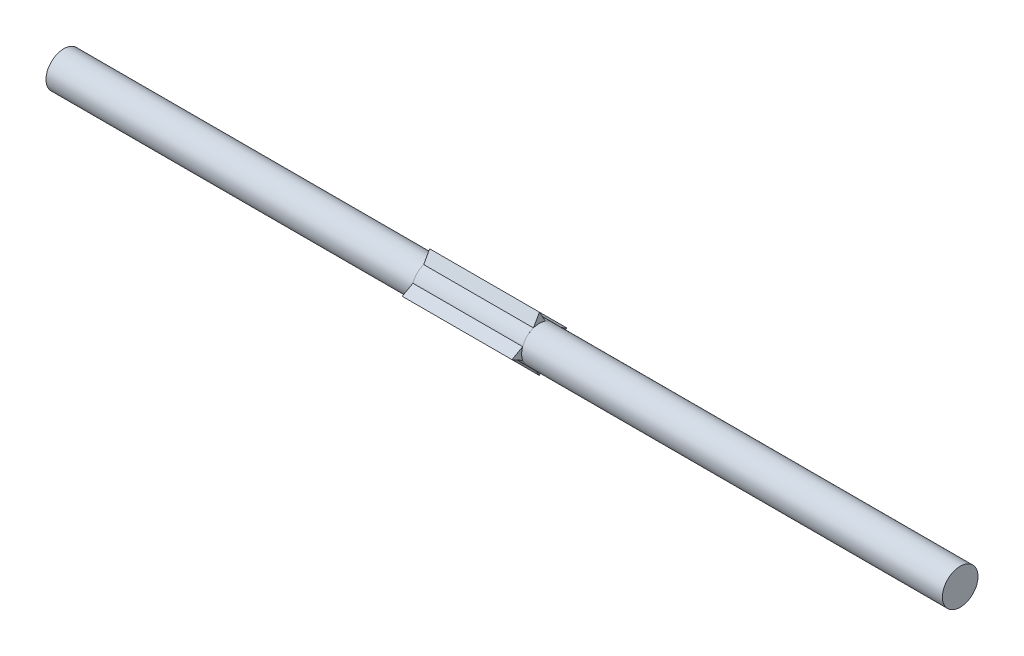
ISO-10303-21;
HEADER;
FILE_DESCRIPTION(('STEP AP214'),'2;1');
FILE_NAME('part.step','',(''),(''),'','','');
FILE_SCHEMA(('AUTOMOTIVE_DESIGN { 1 0 10303 214 1 1 1 1 }'));
ENDSEC;
DATA;
#1=APPLICATION_CONTEXT('core data for automotive mechanical design processes');
#2=APPLICATION_PROTOCOL_DEFINITION('international standard','automotive_design',2000,#1);
#3=PRODUCT_CONTEXT('',#1,'mechanical');
#4=PRODUCT('Part','Part','',(#3));
#5=PRODUCT_RELATED_PRODUCT_CATEGORY('part','',(#4));
#6=PRODUCT_DEFINITION_FORMATION('','',#4);
#7=PRODUCT_DEFINITION_CONTEXT('part definition',#1,'design');
#8=PRODUCT_DEFINITION('design','',#6,#7);
#9=PRODUCT_DEFINITION_SHAPE('','',#8);
#10=(LENGTH_UNIT() NAMED_UNIT(*) SI_UNIT(.MILLI.,.METRE.));
#11=(NAMED_UNIT(*) PLANE_ANGLE_UNIT() SI_UNIT($,.RADIAN.));
#12=(NAMED_UNIT(*) SI_UNIT($,.STERADIAN.) SOLID_ANGLE_UNIT());
#13=UNCERTAINTY_MEASURE_WITH_UNIT(LENGTH_MEASURE(1.E-05),#10,'distance_accuracy_value','');
#14=(GEOMETRIC_REPRESENTATION_CONTEXT(3) GLOBAL_UNCERTAINTY_ASSIGNED_CONTEXT((#13)) GLOBAL_UNIT_ASSIGNED_CONTEXT((#10,
#11,#12)) REPRESENTATION_CONTEXT('',''));
#15=CARTESIAN_POINT('',(0.,0.,0.));
#16=DIRECTION('',(0.,0.,1.));
#17=DIRECTION('',(1.,0.,0.));
#18=AXIS2_PLACEMENT_3D('',#15,#16,#17);
#19=CARTESIAN_POINT('',(15.,0.,0.));
#20=DIRECTION('',(1.,0.,0.));
#21=DIRECTION('',(0.,0.,-1.));
#22=AXIS2_PLACEMENT_3D('',#19,#20,#21);
#23=PLANE('',#22);
#24=CARTESIAN_POINT('',(15.,0.,0.));
#25=DIRECTION('',(1.,0.,0.));
#26=DIRECTION('',(0.,0.,-1.));
#27=AXIS2_PLACEMENT_3D('',#24,#25,#26);
#28=CIRCLE('',#27,4.8625);
#29=CARTESIAN_POINT('',(15.,-1.63235290016241,-4.58031988613583));
#30=VERTEX_POINT('',#29);
#31=CARTESIAN_POINT('',(15.,-4.58031988613585,-1.63235290016237));
#32=VERTEX_POINT('',#31);
#33=EDGE_CURVE('E50',#30,#32,#28,.F.);
#34=ORIENTED_EDGE('',*,*,#33,.F.);
#35=DIRECTION('',(0.,0.487996068424335,-0.87284582670847));
#36=VECTOR('',#35,1.);
#37=CARTESIAN_POINT('',(15.,0.,-7.49999999999954));
#38=LINE('',#37,#36);
#39=CARTESIAN_POINT('',(15.,0.,-7.49999999999954));
#40=VERTEX_POINT('',#39);
#41=EDGE_CURVE('E229',#30,#40,#38,.T.);
#42=ORIENTED_EDGE('',*,*,#41,.T.);
#43=DIRECTION('',(0.,0.487996068424338,0.872845826708468));
#44=VECTOR('',#43,1.);
#45=CARTESIAN_POINT('',(15.,0.,-7.49999999999954));
#46=LINE('',#45,#44);
#47=CARTESIAN_POINT('',(15.,1.63235290016236,-4.58031988613585));
#48=VERTEX_POINT('',#47);
#49=EDGE_CURVE('E215',#40,#48,#46,.T.);
#50=ORIENTED_EDGE('',*,*,#49,.T.);
#51=CARTESIAN_POINT('',(15.,4.58031988613584,-1.6323529001624));
#52=VERTEX_POINT('',#51);
#53=EDGE_CURVE('E166',#52,#48,#28,.F.);
#54=ORIENTED_EDGE('',*,*,#53,.F.);
#55=DIRECTION('',(0.,0.872845826708468,0.487996068424338));
#56=VECTOR('',#55,1.);
#57=CARTESIAN_POINT('',(15.,7.49999999999954,0.));
#58=LINE('',#57,#56);
#59=CARTESIAN_POINT('',(15.,7.49999999999954,0.));
#60=VERTEX_POINT('',#59);
#61=EDGE_CURVE('E219',#52,#60,#58,.T.);
#62=ORIENTED_EDGE('',*,*,#61,.T.);
#63=DIRECTION('',(0.,-0.872845826708468,0.487996068424338));
#64=VECTOR('',#63,1.);
#65=CARTESIAN_POINT('',(15.,7.49999999999954,0.));
#66=LINE('',#65,#64);
#67=CARTESIAN_POINT('',(15.,4.58031988613584,1.6323529001624));
#68=VERTEX_POINT('',#67);
#69=EDGE_CURVE('E112',#60,#68,#66,.T.);
#70=ORIENTED_EDGE('',*,*,#69,.T.);
#71=CARTESIAN_POINT('',(15.,1.63235290016236,4.58031988613585));
#72=VERTEX_POINT('',#71);
#73=EDGE_CURVE('E106',#72,#68,#28,.F.);
#74=ORIENTED_EDGE('',*,*,#73,.F.);
#75=DIRECTION('',(0.,-0.487996068424314,0.872845826708481));
#76=VECTOR('',#75,1.);
#77=CARTESIAN_POINT('',(15.,0.,7.49999999999954));
#78=LINE('',#77,#76);
#79=CARTESIAN_POINT('',(15.,0.,7.49999999999954));
#80=VERTEX_POINT('',#79);
#81=EDGE_CURVE('E188',#72,#80,#78,.T.);
#82=ORIENTED_EDGE('',*,*,#81,.T.);
#83=DIRECTION('',(0.,-0.487996068424347,-0.872845826708463));
#84=VECTOR('',#83,1.);
#85=CARTESIAN_POINT('',(15.,0.,7.49999999999954));
#86=LINE('',#85,#84);
#87=CARTESIAN_POINT('',(15.,-1.63235290016235,4.58031988613585));
#88=VERTEX_POINT('',#87);
#89=EDGE_CURVE('E186',#80,#88,#86,.T.);
#90=ORIENTED_EDGE('',*,*,#89,.T.);
#91=CARTESIAN_POINT('',(15.,-4.58031988613582,1.63235290016243));
#92=VERTEX_POINT('',#91);
#93=EDGE_CURVE('E173',#92,#88,#28,.F.);
#94=ORIENTED_EDGE('',*,*,#93,.F.);
#95=DIRECTION('',(0.,-0.87284582670846,-0.487996068424352));
#96=VECTOR('',#95,1.);
#97=CARTESIAN_POINT('',(15.,-7.49999999999948,0.));
#98=LINE('',#97,#96);
#99=CARTESIAN_POINT('',(15.,-7.49999999999948,0.));
#100=VERTEX_POINT('',#99);
#101=EDGE_CURVE('E192',#92,#100,#98,.T.);
#102=ORIENTED_EDGE('',*,*,#101,.T.);
#103=DIRECTION('',(0.,0.872845826708466,-0.487996068424341));
#104=VECTOR('',#103,1.);
#105=CARTESIAN_POINT('',(15.,-7.49999999999948,0.));
#106=LINE('',#105,#104);
#107=EDGE_CURVE('E231',#100,#32,#106,.T.);
#108=ORIENTED_EDGE('',*,*,#107,.T.);
#109=EDGE_LOOP('',(#34,#42,#50,#54,#62,#70,#74,#82,#90,#94,#102,#108));
#110=FACE_BOUND('',#109,.T.);
#111=ADVANCED_FACE('F46',(#110),#23,.T.);
#112=CARTESIAN_POINT('',(-15.,0.,0.));
#113=DIRECTION('',(-1.,0.,0.));
#114=DIRECTION('',(0.,0.,1.));
#115=AXIS2_PLACEMENT_3D('',#112,#113,#114);
#116=PLANE('',#115);
#117=CARTESIAN_POINT('',(-15.,0.,0.));
#118=DIRECTION('',(-1.,0.,0.));
#119=DIRECTION('',(0.,0.,1.));
#120=AXIS2_PLACEMENT_3D('',#117,#118,#119);
#121=CIRCLE('',#120,4.8625);
#122=CARTESIAN_POINT('',(-15.,-1.63235290016235,4.58031988613585));
#123=VERTEX_POINT('',#122);
#124=CARTESIAN_POINT('',(-15.,-4.58031988613583,1.63235290016243));
#125=VERTEX_POINT('',#124);
#126=EDGE_CURVE('E160',#123,#125,#121,.F.);
#127=ORIENTED_EDGE('',*,*,#126,.F.);
#128=DIRECTION('',(0.,-0.487996068424347,-0.872845826708463));
#129=VECTOR('',#128,1.);
#130=CARTESIAN_POINT('',(-15.,0.,7.49999999999954));
#131=LINE('',#130,#129);
#132=CARTESIAN_POINT('',(-15.,0.,7.49999999999954));
#133=VERTEX_POINT('',#132);
#134=EDGE_CURVE('E195',#133,#123,#131,.T.);
#135=ORIENTED_EDGE('',*,*,#134,.F.);
#136=DIRECTION('',(0.,-0.487996068424314,0.872845826708481));
#137=VECTOR('',#136,1.);
#138=CARTESIAN_POINT('',(-15.,0.,7.49999999999954));
#139=LINE('',#138,#137);
#140=CARTESIAN_POINT('',(-15.,1.63235290016236,4.58031988613585));
#141=VERTEX_POINT('',#140);
#142=EDGE_CURVE('E153',#141,#133,#139,.T.);
#143=ORIENTED_EDGE('',*,*,#142,.F.);
#144=CARTESIAN_POINT('',(-15.,4.58031988613584,1.6323529001624));
#145=VERTEX_POINT('',#144);
#146=EDGE_CURVE('E147',#145,#141,#121,.F.);
#147=ORIENTED_EDGE('',*,*,#146,.F.);
#148=DIRECTION('',(0.,-0.872845826708468,0.487996068424338));
#149=VECTOR('',#148,1.);
#150=CARTESIAN_POINT('',(-15.,7.49999999999954,0.));
#151=LINE('',#150,#149);
#152=CARTESIAN_POINT('',(-15.,7.49999999999954,0.));
#153=VERTEX_POINT('',#152);
#154=EDGE_CURVE('E56',#153,#145,#151,.T.);
#155=ORIENTED_EDGE('',*,*,#154,.F.);
#156=DIRECTION('',(0.,0.872845826708468,0.487996068424338));
#157=VECTOR('',#156,1.);
#158=CARTESIAN_POINT('',(-15.,7.49999999999954,0.));
#159=LINE('',#158,#157);
#160=CARTESIAN_POINT('',(-15.,4.58031988613584,-1.6323529001624));
#161=VERTEX_POINT('',#160);
#162=EDGE_CURVE('E13',#161,#153,#159,.T.);
#163=ORIENTED_EDGE('',*,*,#162,.F.);
#164=CARTESIAN_POINT('',(-15.,1.63235290016236,-4.58031988613585));
#165=VERTEX_POINT('',#164);
#166=EDGE_CURVE('E159',#165,#161,#121,.F.);
#167=ORIENTED_EDGE('',*,*,#166,.F.);
#168=DIRECTION('',(0.,0.487996068424338,0.872845826708468));
#169=VECTOR('',#168,1.);
#170=CARTESIAN_POINT('',(-15.,0.,-7.49999999999954));
#171=LINE('',#170,#169);
#172=CARTESIAN_POINT('',(-15.,0.,-7.49999999999954));
#173=VERTEX_POINT('',#172);
#174=EDGE_CURVE('E216',#173,#165,#171,.T.);
#175=ORIENTED_EDGE('',*,*,#174,.F.);
#176=DIRECTION('',(0.,0.487996068424335,-0.87284582670847));
#177=VECTOR('',#176,1.);
#178=CARTESIAN_POINT('',(-15.,0.,-7.49999999999954));
#179=LINE('',#178,#177);
#180=CARTESIAN_POINT('',(-15.,-1.63235290016241,-4.58031988613583));
#181=VERTEX_POINT('',#180);
#182=EDGE_CURVE('E120',#181,#173,#179,.T.);
#183=ORIENTED_EDGE('',*,*,#182,.F.);
#184=CARTESIAN_POINT('',(-15.,-4.58031988613585,-1.63235290016237));
#185=VERTEX_POINT('',#184);
#186=EDGE_CURVE('E163',#185,#181,#121,.F.);
#187=ORIENTED_EDGE('',*,*,#186,.F.);
#188=DIRECTION('',(0.,0.872845826708466,-0.487996068424341));
#189=VECTOR('',#188,1.);
#190=CARTESIAN_POINT('',(-15.,-7.49999999999948,0.));
#191=LINE('',#190,#189);
#192=CARTESIAN_POINT('',(-15.,-7.49999999999948,0.));
#193=VERTEX_POINT('',#192);
#194=EDGE_CURVE('E221',#193,#185,#191,.T.);
#195=ORIENTED_EDGE('',*,*,#194,.F.);
#196=DIRECTION('',(0.,-0.87284582670846,-0.487996068424352));
#197=VECTOR('',#196,1.);
#198=CARTESIAN_POINT('',(-15.,-7.49999999999948,0.));
#199=LINE('',#198,#197);
#200=EDGE_CURVE('E224',#125,#193,#199,.T.);
#201=ORIENTED_EDGE('',*,*,#200,.F.);
#202=EDGE_LOOP('',(#127,#135,#143,#147,#155,#163,#167,#175,#183,#187,#195,#201));
#203=FACE_BOUND('',#202,.T.);
#204=ADVANCED_FACE('F157',(#203),#116,.T.);
#205=CARTESIAN_POINT('',(-115.,0.,0.));
#206=DIRECTION('',(-1.,0.,0.));
#207=DIRECTION('',(0.,0.,1.));
#208=AXIS2_PLACEMENT_3D('',#205,#206,#207);
#209=CYLINDRICAL_SURFACE('',#208,4.8625);
#210=DIRECTION('',(-1.,0.,0.));
#211=VECTOR('',#210,1.);
#212=CARTESIAN_POINT('',(15.,-4.58031988613582,1.63235290016243));
#213=LINE('',#212,#211);
#214=EDGE_CURVE('E182',#92,#125,#213,.T.);
#215=ORIENTED_EDGE('',*,*,#214,.F.);
#216=ORIENTED_EDGE('',*,*,#93,.T.);
#217=DIRECTION('',(-1.,0.,0.));
#218=VECTOR('',#217,1.);
#219=CARTESIAN_POINT('',(15.,-1.63235290016235,4.58031988613585));
#220=LINE('',#219,#218);
#221=EDGE_CURVE('E180',#88,#123,#220,.T.);
#222=ORIENTED_EDGE('',*,*,#221,.T.);
#223=ORIENTED_EDGE('',*,*,#126,.T.);
#224=EDGE_LOOP('',(#215,#216,#222,#223));
#225=FACE_BOUND('',#224,.T.);
#226=ADVANCED_FACE('F178',(#225),#209,.T.);
#227=CARTESIAN_POINT('',(15.,-7.49999999999948,0.));
#228=DIRECTION('',(0.,0.487996068424352,-0.87284582670846));
#229=DIRECTION('',(0.,0.87284582670846,0.487996068424352));
#230=AXIS2_PLACEMENT_3D('',#227,#228,#229);
#231=PLANE('',#230);
#232=ORIENTED_EDGE('',*,*,#200,.T.);
#233=DIRECTION('',(-1.,0.,0.));
#234=VECTOR('',#233,1.);
#235=CARTESIAN_POINT('',(15.,-7.49999999999948,0.));
#236=LINE('',#235,#234);
#237=EDGE_CURVE('E198',#100,#193,#236,.T.);
#238=ORIENTED_EDGE('',*,*,#237,.F.);
#239=ORIENTED_EDGE('',*,*,#101,.F.);
#240=ORIENTED_EDGE('',*,*,#214,.T.);
#241=EDGE_LOOP('',(#232,#238,#239,#240));
#242=FACE_BOUND('',#241,.T.);
#243=ADVANCED_FACE('F254',(#242),#231,.F.);
#244=DIRECTION('',(-1.,0.,0.));
#245=VECTOR('',#244,1.);
#246=CARTESIAN_POINT('',(15.,-1.63235290016241,-4.58031988613583));
#247=LINE('',#246,#245);
#248=EDGE_CURVE('E207',#30,#181,#247,.T.);
#249=ORIENTED_EDGE('',*,*,#248,.F.);
#250=ORIENTED_EDGE('',*,*,#33,.T.);
#251=DIRECTION('',(-1.,0.,0.));
#252=VECTOR('',#251,1.);
#253=CARTESIAN_POINT('',(15.,-4.58031988613585,-1.63235290016237));
#254=LINE('',#253,#252);
#255=EDGE_CURVE('E205',#32,#185,#254,.T.);
#256=ORIENTED_EDGE('',*,*,#255,.T.);
#257=ORIENTED_EDGE('',*,*,#186,.T.);
#258=EDGE_LOOP('',(#249,#250,#256,#257));
#259=FACE_BOUND('',#258,.T.);
#260=ADVANCED_FACE('F48',(#259),#209,.T.);
#261=CARTESIAN_POINT('',(15.,-7.49999999999948,0.));
#262=DIRECTION('',(0.,0.487996068424341,0.872845826708466));
#263=DIRECTION('',(0.,-0.872845826708466,0.487996068424341));
#264=AXIS2_PLACEMENT_3D('',#261,#262,#263);
#265=PLANE('',#264);
#266=ORIENTED_EDGE('',*,*,#194,.T.);
#267=ORIENTED_EDGE('',*,*,#255,.F.);
#268=ORIENTED_EDGE('',*,*,#107,.F.);
#269=ORIENTED_EDGE('',*,*,#237,.T.);
#270=EDGE_LOOP('',(#266,#267,#268,#269));
#271=FACE_BOUND('',#270,.T.);
#272=ADVANCED_FACE('F250',(#271),#265,.F.);
#273=DIRECTION('',(-1.,0.,0.));
#274=VECTOR('',#273,1.);
#275=CARTESIAN_POINT('',(15.,1.63235290016236,4.58031988613585));
#276=LINE('',#275,#274);
#277=EDGE_CURVE('E148',#72,#141,#276,.T.);
#278=ORIENTED_EDGE('',*,*,#277,.F.);
#279=ORIENTED_EDGE('',*,*,#73,.T.);
#280=DIRECTION('',(-1.,0.,0.));
#281=VECTOR('',#280,1.);
#282=CARTESIAN_POINT('',(15.,4.58031988613584,1.6323529001624));
#283=LINE('',#282,#281);
#284=EDGE_CURVE('E145',#68,#145,#283,.T.);
#285=ORIENTED_EDGE('',*,*,#284,.T.);
#286=ORIENTED_EDGE('',*,*,#146,.T.);
#287=EDGE_LOOP('',(#278,#279,#285,#286));
#288=FACE_BOUND('',#287,.T.);
#289=ADVANCED_FACE('F146',(#288),#209,.T.);
#290=CARTESIAN_POINT('',(15.,0.,7.49999999999954));
#291=DIRECTION('',(0.,0.872845826708463,-0.487996068424347));
#292=DIRECTION('',(0.,0.487996068424347,0.872845826708463));
#293=AXIS2_PLACEMENT_3D('',#290,#291,#292);
#294=PLANE('',#293);
#295=ORIENTED_EDGE('',*,*,#134,.T.);
#296=ORIENTED_EDGE('',*,*,#221,.F.);
#297=ORIENTED_EDGE('',*,*,#89,.F.);
#298=DIRECTION('',(-1.,0.,0.));
#299=VECTOR('',#298,1.);
#300=CARTESIAN_POINT('',(15.,0.,7.49999999999954));
#301=LINE('',#300,#299);
#302=EDGE_CURVE('E196',#80,#133,#301,.T.);
#303=ORIENTED_EDGE('',*,*,#302,.T.);
#304=EDGE_LOOP('',(#295,#296,#297,#303));
#305=FACE_BOUND('',#304,.T.);
#306=ADVANCED_FACE('F194',(#305),#294,.F.);
#307=CARTESIAN_POINT('',(15.,0.,7.49999999999954));
#308=DIRECTION('',(0.,-0.872845826708481,-0.487996068424314));
#309=DIRECTION('',(0.,0.487996068424314,-0.872845826708482));
#310=AXIS2_PLACEMENT_3D('',#307,#308,#309);
#311=PLANE('',#310);
#312=ORIENTED_EDGE('',*,*,#142,.T.);
#313=ORIENTED_EDGE('',*,*,#302,.F.);
#314=ORIENTED_EDGE('',*,*,#81,.F.);
#315=ORIENTED_EDGE('',*,*,#277,.T.);
#316=EDGE_LOOP('',(#312,#313,#314,#315));
#317=FACE_BOUND('',#316,.T.);
#318=ADVANCED_FACE('F278',(#317),#311,.F.);
#319=DIRECTION('',(-1.,0.,0.));
#320=VECTOR('',#319,1.);
#321=CARTESIAN_POINT('',(15.,4.58031988613584,-1.6323529001624));
#322=LINE('',#321,#320);
#323=EDGE_CURVE('E213',#52,#161,#322,.T.);
#324=ORIENTED_EDGE('',*,*,#323,.F.);
#325=ORIENTED_EDGE('',*,*,#53,.T.);
#326=DIRECTION('',(-1.,0.,0.));
#327=VECTOR('',#326,1.);
#328=CARTESIAN_POINT('',(15.,1.63235290016236,-4.58031988613585));
#329=LINE('',#328,#327);
#330=EDGE_CURVE('E211',#48,#165,#329,.T.);
#331=ORIENTED_EDGE('',*,*,#330,.T.);
#332=ORIENTED_EDGE('',*,*,#166,.T.);
#333=EDGE_LOOP('',(#324,#325,#331,#332));
#334=FACE_BOUND('',#333,.T.);
#335=ADVANCED_FACE('F240',(#334),#209,.T.);
#336=CARTESIAN_POINT('',(15.,7.49999999999954,0.));
#337=DIRECTION('',(0.,-0.487996068424338,-0.872845826708468));
#338=DIRECTION('',(0.,0.872845826708468,-0.487996068424338));
#339=AXIS2_PLACEMENT_3D('',#336,#337,#338);
#340=PLANE('',#339);
#341=ORIENTED_EDGE('',*,*,#154,.T.);
#342=ORIENTED_EDGE('',*,*,#284,.F.);
#343=ORIENTED_EDGE('',*,*,#69,.F.);
#344=DIRECTION('',(-1.,0.,0.));
#345=VECTOR('',#344,1.);
#346=CARTESIAN_POINT('',(15.,7.49999999999954,0.));
#347=LINE('',#346,#345);
#348=EDGE_CURVE('E149',#60,#153,#347,.T.);
#349=ORIENTED_EDGE('',*,*,#348,.T.);
#350=EDGE_LOOP('',(#341,#342,#343,#349));
#351=FACE_BOUND('',#350,.T.);
#352=ADVANCED_FACE('F151',(#351),#340,.F.);
#353=CARTESIAN_POINT('',(15.,7.49999999999954,0.));
#354=DIRECTION('',(0.,-0.487996068424338,0.872845826708468));
#355=DIRECTION('',(0.,-0.872845826708468,-0.487996068424338));
#356=AXIS2_PLACEMENT_3D('',#353,#354,#355);
#357=PLANE('',#356);
#358=ORIENTED_EDGE('',*,*,#162,.T.);
#359=ORIENTED_EDGE('',*,*,#348,.F.);
#360=ORIENTED_EDGE('',*,*,#61,.F.);
#361=ORIENTED_EDGE('',*,*,#323,.T.);
#362=EDGE_LOOP('',(#358,#359,#360,#361));
#363=FACE_BOUND('',#362,.T.);
#364=ADVANCED_FACE('F237',(#363),#357,.F.);
#365=CARTESIAN_POINT('',(15.,0.,-7.49999999999954));
#366=DIRECTION('',(0.,-0.872845826708468,0.487996068424338));
#367=DIRECTION('',(0.,-0.487996068424338,-0.872845826708468));
#368=AXIS2_PLACEMENT_3D('',#365,#366,#367);
#369=PLANE('',#368);
#370=ORIENTED_EDGE('',*,*,#174,.T.);
#371=ORIENTED_EDGE('',*,*,#330,.F.);
#372=ORIENTED_EDGE('',*,*,#49,.F.);
#373=DIRECTION('',(-1.,0.,0.));
#374=VECTOR('',#373,1.);
#375=CARTESIAN_POINT('',(15.,0.,-7.49999999999954));
#376=LINE('',#375,#374);
#377=EDGE_CURVE('E209',#40,#173,#376,.T.);
#378=ORIENTED_EDGE('',*,*,#377,.T.);
#379=EDGE_LOOP('',(#370,#371,#372,#378));
#380=FACE_BOUND('',#379,.T.);
#381=ADVANCED_FACE('F244',(#380),#369,.F.);
#382=CARTESIAN_POINT('',(15.,0.,-7.49999999999954));
#383=DIRECTION('',(0.,0.87284582670847,0.487996068424335));
#384=DIRECTION('',(0.,-0.487996068424335,0.87284582670847));
#385=AXIS2_PLACEMENT_3D('',#382,#383,#384);
#386=PLANE('',#385);
#387=ORIENTED_EDGE('',*,*,#182,.T.);
#388=ORIENTED_EDGE('',*,*,#377,.F.);
#389=ORIENTED_EDGE('',*,*,#41,.F.);
#390=ORIENTED_EDGE('',*,*,#248,.T.);
#391=EDGE_LOOP('',(#387,#388,#389,#390));
#392=FACE_BOUND('',#391,.T.);
#393=ADVANCED_FACE('F256',(#392),#386,.F.);
#394=CLOSED_SHELL('',(#111,#204,#226,#243,#260,#272,#289,#306,#318,#335,#352,#364,#381,#393));
#395=MANIFOLD_SOLID_BREP('B2',#394);
#396=CARTESIAN_POINT('',(15.,0.,0.));
#397=DIRECTION('',(1.,0.,0.));
#398=DIRECTION('',(0.,0.,-1.));
#399=AXIS2_PLACEMENT_3D('',#396,#397,#398);
#400=PLANE('',#399);
#401=CARTESIAN_POINT('',(15.,0.,0.));
#402=DIRECTION('',(1.,0.,0.));
#403=DIRECTION('',(0.,0.,-1.));
#404=AXIS2_PLACEMENT_3D('',#401,#402,#403);
#405=CIRCLE('',#404,4.8625);
#406=CARTESIAN_POINT('',(15.,0.,-4.8625));
#407=VERTEX_POINT('',#406);
#408=EDGE_CURVE('E45',#407,#407,#405,.F.);
#409=ORIENTED_EDGE('',*,*,#408,.T.);
#410=EDGE_LOOP('',(#409));
#411=FACE_BOUND('',#410,.T.);
#412=ADVANCED_FACE('F382',(#411),#400,.F.);
#413=CARTESIAN_POINT('',(-115.,0.,0.));
#414=DIRECTION('',(-1.,0.,0.));
#415=DIRECTION('',(0.,0.,1.));
#416=AXIS2_PLACEMENT_3D('',#413,#414,#415);
#417=CYLINDRICAL_SURFACE('',#416,4.8625);
#418=ORIENTED_EDGE('',*,*,#408,.F.);
#419=EDGE_LOOP('',(#418));
#420=FACE_BOUND('',#419,.T.);
#421=CARTESIAN_POINT('',(130.,0.,0.));
#422=DIRECTION('',(1.,0.,0.));
#423=DIRECTION('',(0.,0.,-1.));
#424=AXIS2_PLACEMENT_3D('',#421,#422,#423);
#425=CIRCLE('',#424,4.8625);
#426=CARTESIAN_POINT('',(130.,0.,-4.8625));
#427=VERTEX_POINT('',#426);
#428=EDGE_CURVE('E389',#427,#427,#425,.T.);
#429=ORIENTED_EDGE('',*,*,#428,.F.);
#430=EDGE_LOOP('',(#429));
#431=FACE_BOUND('',#430,.T.);
#432=ADVANCED_FACE('F384',(#420,#431),#417,.T.);
#433=CARTESIAN_POINT('',(130.,0.,0.));
#434=DIRECTION('',(1.,0.,0.));
#435=DIRECTION('',(0.,0.,-1.));
#436=AXIS2_PLACEMENT_3D('',#433,#434,#435);
#437=PLANE('',#436);
#438=ORIENTED_EDGE('',*,*,#428,.T.);
#439=EDGE_LOOP('',(#438));
#440=FACE_BOUND('',#439,.T.);
#441=ADVANCED_FACE('F395',(#440),#437,.T.);
#442=CLOSED_SHELL('',(#412,#432,#441));
#443=MANIFOLD_SOLID_BREP('B7',#442);
#444=CARTESIAN_POINT('',(-15.,0.,0.));
#445=DIRECTION('',(-1.,0.,0.));
#446=DIRECTION('',(0.,0.,1.));
#447=AXIS2_PLACEMENT_3D('',#444,#445,#446);
#448=PLANE('',#447);
#449=CARTESIAN_POINT('',(-15.,0.,0.));
#450=DIRECTION('',(1.,0.,0.));
#451=DIRECTION('',(0.,0.,-1.));
#452=AXIS2_PLACEMENT_3D('',#449,#450,#451);
#453=CIRCLE('',#452,4.8625);
#454=CARTESIAN_POINT('',(-15.,0.,-4.8625));
#455=VERTEX_POINT('',#454);
#456=EDGE_CURVE('E381',#455,#455,#453,.F.);
#457=ORIENTED_EDGE('',*,*,#456,.F.);
#458=EDGE_LOOP('',(#457));
#459=FACE_BOUND('',#458,.T.);
#460=ADVANCED_FACE('F428',(#459),#448,.F.);
#461=CARTESIAN_POINT('',(-115.,0.,0.));
#462=DIRECTION('',(-1.,0.,0.));
#463=DIRECTION('',(0.,0.,1.));
#464=AXIS2_PLACEMENT_3D('',#461,#462,#463);
#465=PLANE('',#464);
#466=CARTESIAN_POINT('',(-115.,0.,0.));
#467=DIRECTION('',(-1.,0.,0.));
#468=DIRECTION('',(0.,0.,1.));
#469=AXIS2_PLACEMENT_3D('',#466,#467,#468);
#470=CIRCLE('',#469,4.8625);
#471=CARTESIAN_POINT('',(-115.,0.,4.8625));
#472=VERTEX_POINT('',#471);
#473=EDGE_CURVE('E434',#472,#472,#470,.T.);
#474=ORIENTED_EDGE('',*,*,#473,.T.);
#475=EDGE_LOOP('',(#474));
#476=FACE_BOUND('',#475,.T.);
#477=ADVANCED_FACE('F440',(#476),#465,.T.);
#478=CARTESIAN_POINT('',(-115.,0.,0.));
#479=DIRECTION('',(-1.,0.,0.));
#480=DIRECTION('',(0.,0.,1.));
#481=AXIS2_PLACEMENT_3D('',#478,#479,#480);
#482=CYLINDRICAL_SURFACE('',#481,4.8625);
#483=ORIENTED_EDGE('',*,*,#456,.T.);
#484=EDGE_LOOP('',(#483));
#485=FACE_BOUND('',#484,.T.);
#486=ORIENTED_EDGE('',*,*,#473,.F.);
#487=EDGE_LOOP('',(#486));
#488=FACE_BOUND('',#487,.T.);
#489=ADVANCED_FACE('F442',(#485,#488),#482,.T.);
#490=CLOSED_SHELL('',(#460,#477,#489));
#491=MANIFOLD_SOLID_BREP('B40',#490);
#492=ADVANCED_BREP_SHAPE_REPRESENTATION('',(#18,#395,#443,#491),#14);
#493=SHAPE_DEFINITION_REPRESENTATION(#9,#492);
ENDSEC;
END-ISO-10303-21;
